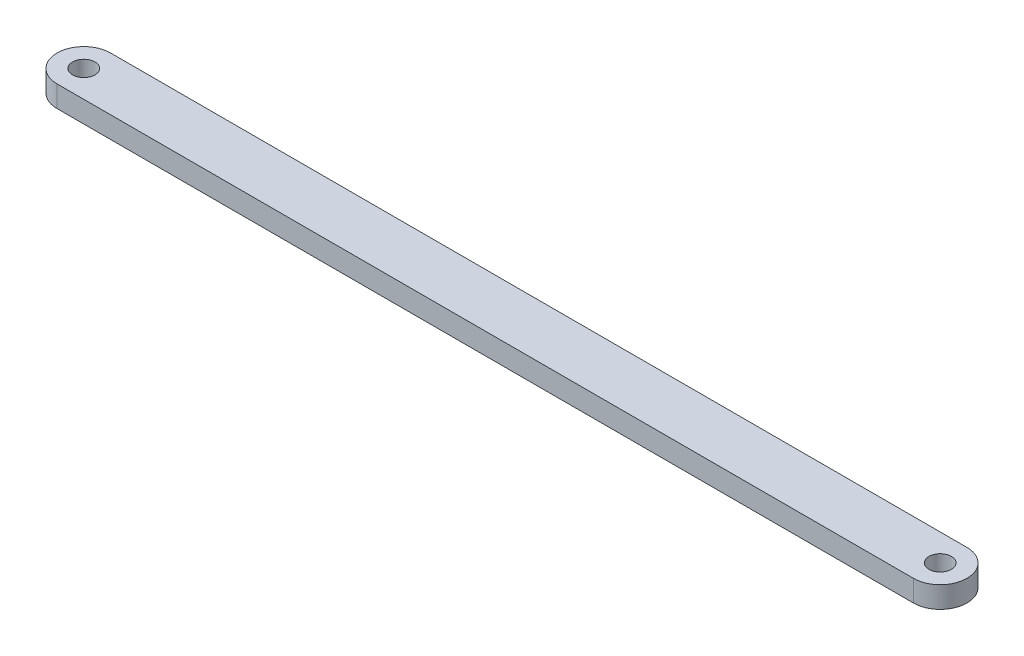
ISO-10303-21;
HEADER;
FILE_DESCRIPTION(('STEP AP214'),'2;1');
FILE_NAME('part.step','',(''),(''),'','','');
FILE_SCHEMA(('AUTOMOTIVE_DESIGN { 1 0 10303 214 1 1 1 1 }'));
ENDSEC;
DATA;
#1=APPLICATION_CONTEXT('core data for automotive mechanical design processes');
#2=APPLICATION_PROTOCOL_DEFINITION('international standard','automotive_design',2000,#1);
#3=PRODUCT_CONTEXT('',#1,'mechanical');
#4=PRODUCT('Part','Part','',(#3));
#5=PRODUCT_RELATED_PRODUCT_CATEGORY('part','',(#4));
#6=PRODUCT_DEFINITION_FORMATION('','',#4);
#7=PRODUCT_DEFINITION_CONTEXT('part definition',#1,'design');
#8=PRODUCT_DEFINITION('design','',#6,#7);
#9=PRODUCT_DEFINITION_SHAPE('','',#8);
#10=(LENGTH_UNIT() NAMED_UNIT(*) SI_UNIT(.MILLI.,.METRE.));
#11=(NAMED_UNIT(*) PLANE_ANGLE_UNIT() SI_UNIT($,.RADIAN.));
#12=(NAMED_UNIT(*) SI_UNIT($,.STERADIAN.) SOLID_ANGLE_UNIT());
#13=UNCERTAINTY_MEASURE_WITH_UNIT(LENGTH_MEASURE(1.E-05),#10,'distance_accuracy_value','');
#14=(GEOMETRIC_REPRESENTATION_CONTEXT(3) GLOBAL_UNCERTAINTY_ASSIGNED_CONTEXT((#13)) GLOBAL_UNIT_ASSIGNED_CONTEXT((#10,
#11,#12)) REPRESENTATION_CONTEXT('',''));
#15=CARTESIAN_POINT('',(0.,0.,0.));
#16=DIRECTION('',(0.,0.,1.));
#17=DIRECTION('',(1.,0.,0.));
#18=AXIS2_PLACEMENT_3D('',#15,#16,#17);
#19=CARTESIAN_POINT('',(0.,2.,0.));
#20=DIRECTION('',(0.,1.,0.));
#21=DIRECTION('',(0.,0.,1.));
#22=AXIS2_PLACEMENT_3D('',#19,#20,#21);
#23=PLANE('',#22);
#24=CARTESIAN_POINT('',(0.,2.,0.));
#25=DIRECTION('',(0.,1.,0.));
#26=DIRECTION('',(0.,0.,1.));
#27=AXIS2_PLACEMENT_3D('',#24,#25,#26);
#28=CIRCLE('',#27,1.05);
#29=CARTESIAN_POINT('',(0.,2.,1.05));
#30=VERTEX_POINT('',#29);
#31=EDGE_CURVE('E103',#30,#30,#28,.T.);
#32=ORIENTED_EDGE('',*,*,#31,.F.);
#33=EDGE_LOOP('',(#32));
#34=FACE_BOUND('',#33,.T.);
#35=CARTESIAN_POINT('',(0.,2.,0.));
#36=DIRECTION('',(0.,1.,0.));
#37=DIRECTION('',(0.,0.,1.));
#38=AXIS2_PLACEMENT_3D('',#35,#36,#37);
#39=CIRCLE('',#38,2.5);
#40=CARTESIAN_POINT('',(0.,2.,-2.5));
#41=VERTEX_POINT('',#40);
#42=CARTESIAN_POINT('',(0.,2.,2.5));
#43=VERTEX_POINT('',#42);
#44=EDGE_CURVE('E88',#41,#43,#39,.T.);
#45=ORIENTED_EDGE('',*,*,#44,.T.);
#46=DIRECTION('',(1.,0.,0.));
#47=VECTOR('',#46,1.);
#48=CARTESIAN_POINT('',(0.,2.,2.5));
#49=LINE('',#48,#47);
#50=CARTESIAN_POINT('',(80.,2.,2.5));
#51=VERTEX_POINT('',#50);
#52=EDGE_CURVE('E83',#43,#51,#49,.T.);
#53=ORIENTED_EDGE('',*,*,#52,.T.);
#54=CARTESIAN_POINT('',(80.,2.,0.));
#55=DIRECTION('',(0.,1.,0.));
#56=DIRECTION('',(0.,0.,1.));
#57=AXIS2_PLACEMENT_3D('',#54,#55,#56);
#58=CIRCLE('',#57,2.5);
#59=CARTESIAN_POINT('',(80.,2.,-2.5));
#60=VERTEX_POINT('',#59);
#61=EDGE_CURVE('E86',#51,#60,#58,.T.);
#62=ORIENTED_EDGE('',*,*,#61,.T.);
#63=DIRECTION('',(-1.,0.,0.));
#64=VECTOR('',#63,1.);
#65=CARTESIAN_POINT('',(0.,2.,-2.5));
#66=LINE('',#65,#64);
#67=EDGE_CURVE('E53',#60,#41,#66,.T.);
#68=ORIENTED_EDGE('',*,*,#67,.T.);
#69=EDGE_LOOP('',(#45,#53,#62,#68));
#70=FACE_BOUND('',#69,.T.);
#71=CARTESIAN_POINT('',(80.,2.,0.));
#72=DIRECTION('',(0.,1.,0.));
#73=DIRECTION('',(0.,0.,1.));
#74=AXIS2_PLACEMENT_3D('',#71,#72,#73);
#75=CIRCLE('',#74,1.04999999999999);
#76=CARTESIAN_POINT('',(80.,2.,1.04999999999999));
#77=VERTEX_POINT('',#76);
#78=EDGE_CURVE('E118',#77,#77,#75,.T.);
#79=ORIENTED_EDGE('',*,*,#78,.F.);
#80=EDGE_LOOP('',(#79));
#81=FACE_BOUND('',#80,.T.);
#82=ADVANCED_FACE('F36',(#34,#70,#81),#23,.T.);
#83=CARTESIAN_POINT('',(0.,0.,0.));
#84=DIRECTION('',(0.,1.,0.));
#85=DIRECTION('',(0.,0.,1.));
#86=AXIS2_PLACEMENT_3D('',#83,#84,#85);
#87=PLANE('',#86);
#88=CARTESIAN_POINT('',(0.,0.,0.));
#89=DIRECTION('',(0.,1.,0.));
#90=DIRECTION('',(0.,0.,1.));
#91=AXIS2_PLACEMENT_3D('',#88,#89,#90);
#92=CIRCLE('',#91,2.5);
#93=CARTESIAN_POINT('',(0.,0.,-2.5));
#94=VERTEX_POINT('',#93);
#95=CARTESIAN_POINT('',(0.,0.,2.5));
#96=VERTEX_POINT('',#95);
#97=EDGE_CURVE('E100',#94,#96,#92,.T.);
#98=ORIENTED_EDGE('',*,*,#97,.F.);
#99=DIRECTION('',(-1.,0.,0.));
#100=VECTOR('',#99,1.);
#101=CARTESIAN_POINT('',(0.,0.,-2.5));
#102=LINE('',#101,#100);
#103=CARTESIAN_POINT('',(80.,0.,-2.5));
#104=VERTEX_POINT('',#103);
#105=EDGE_CURVE('E76',#104,#94,#102,.T.);
#106=ORIENTED_EDGE('',*,*,#105,.F.);
#107=CARTESIAN_POINT('',(80.,0.,0.));
#108=DIRECTION('',(0.,1.,0.));
#109=DIRECTION('',(0.,0.,1.));
#110=AXIS2_PLACEMENT_3D('',#107,#108,#109);
#111=CIRCLE('',#110,2.5);
#112=CARTESIAN_POINT('',(80.,0.,2.5));
#113=VERTEX_POINT('',#112);
#114=EDGE_CURVE('E70',#113,#104,#111,.T.);
#115=ORIENTED_EDGE('',*,*,#114,.F.);
#116=DIRECTION('',(1.,0.,0.));
#117=VECTOR('',#116,1.);
#118=CARTESIAN_POINT('',(0.,0.,2.5));
#119=LINE('',#118,#117);
#120=EDGE_CURVE('E92',#96,#113,#119,.T.);
#121=ORIENTED_EDGE('',*,*,#120,.F.);
#122=EDGE_LOOP('',(#98,#106,#115,#121));
#123=FACE_BOUND('',#122,.T.);
#124=CARTESIAN_POINT('',(0.,0.,0.));
#125=DIRECTION('',(0.,1.,0.));
#126=DIRECTION('',(0.,0.,1.));
#127=AXIS2_PLACEMENT_3D('',#124,#125,#126);
#128=CIRCLE('',#127,1.05);
#129=CARTESIAN_POINT('',(0.,0.,1.05));
#130=VERTEX_POINT('',#129);
#131=EDGE_CURVE('E115',#130,#130,#128,.T.);
#132=ORIENTED_EDGE('',*,*,#131,.T.);
#133=EDGE_LOOP('',(#132));
#134=FACE_BOUND('',#133,.T.);
#135=CARTESIAN_POINT('',(80.,0.,0.));
#136=DIRECTION('',(0.,1.,0.));
#137=DIRECTION('',(0.,0.,1.));
#138=AXIS2_PLACEMENT_3D('',#135,#136,#137);
#139=CIRCLE('',#138,1.04999999999999);
#140=CARTESIAN_POINT('',(80.,0.,1.04999999999999));
#141=VERTEX_POINT('',#140);
#142=EDGE_CURVE('E121',#141,#141,#139,.T.);
#143=ORIENTED_EDGE('',*,*,#142,.T.);
#144=EDGE_LOOP('',(#143));
#145=FACE_BOUND('',#144,.T.);
#146=ADVANCED_FACE('F111',(#123,#134,#145),#87,.F.);
#147=CARTESIAN_POINT('',(0.,2.,0.));
#148=DIRECTION('',(0.,-1.,0.));
#149=DIRECTION('',(0.,0.,-1.));
#150=AXIS2_PLACEMENT_3D('',#147,#148,#149);
#151=CYLINDRICAL_SURFACE('',#150,2.5);
#152=ORIENTED_EDGE('',*,*,#97,.T.);
#153=DIRECTION('',(0.,-1.,0.));
#154=VECTOR('',#153,1.);
#155=CARTESIAN_POINT('',(0.,2.,2.5));
#156=LINE('',#155,#154);
#157=EDGE_CURVE('E11',#43,#96,#156,.T.);
#158=ORIENTED_EDGE('',*,*,#157,.F.);
#159=ORIENTED_EDGE('',*,*,#44,.F.);
#160=DIRECTION('',(0.,-1.,0.));
#161=VECTOR('',#160,1.);
#162=CARTESIAN_POINT('',(0.,2.,-2.5));
#163=LINE('',#162,#161);
#164=EDGE_CURVE('E96',#41,#94,#163,.T.);
#165=ORIENTED_EDGE('',*,*,#164,.T.);
#166=EDGE_LOOP('',(#152,#158,#159,#165));
#167=FACE_BOUND('',#166,.T.);
#168=ADVANCED_FACE('F38',(#167),#151,.T.);
#169=CARTESIAN_POINT('',(0.,2.,2.5));
#170=DIRECTION('',(0.,0.,-1.));
#171=DIRECTION('',(-1.,0.,0.));
#172=AXIS2_PLACEMENT_3D('',#169,#170,#171);
#173=PLANE('',#172);
#174=ORIENTED_EDGE('',*,*,#120,.T.);
#175=DIRECTION('',(0.,-1.,0.));
#176=VECTOR('',#175,1.);
#177=CARTESIAN_POINT('',(80.,2.,2.5));
#178=LINE('',#177,#176);
#179=EDGE_CURVE('E45',#51,#113,#178,.T.);
#180=ORIENTED_EDGE('',*,*,#179,.F.);
#181=ORIENTED_EDGE('',*,*,#52,.F.);
#182=ORIENTED_EDGE('',*,*,#157,.T.);
#183=EDGE_LOOP('',(#174,#180,#181,#182));
#184=FACE_BOUND('',#183,.T.);
#185=ADVANCED_FACE('F91',(#184),#173,.F.);
#186=CARTESIAN_POINT('',(80.,2.,0.));
#187=DIRECTION('',(0.,-1.,0.));
#188=DIRECTION('',(0.,0.,-1.));
#189=AXIS2_PLACEMENT_3D('',#186,#187,#188);
#190=CYLINDRICAL_SURFACE('',#189,2.5);
#191=ORIENTED_EDGE('',*,*,#114,.T.);
#192=DIRECTION('',(0.,-1.,0.));
#193=VECTOR('',#192,1.);
#194=CARTESIAN_POINT('',(80.,2.,-2.5));
#195=LINE('',#194,#193);
#196=EDGE_CURVE('E93',#60,#104,#195,.T.);
#197=ORIENTED_EDGE('',*,*,#196,.F.);
#198=ORIENTED_EDGE('',*,*,#61,.F.);
#199=ORIENTED_EDGE('',*,*,#179,.T.);
#200=EDGE_LOOP('',(#191,#197,#198,#199));
#201=FACE_BOUND('',#200,.T.);
#202=ADVANCED_FACE('F94',(#201),#190,.T.);
#203=CARTESIAN_POINT('',(0.,2.,-2.5));
#204=DIRECTION('',(0.,0.,1.));
#205=DIRECTION('',(1.,0.,0.));
#206=AXIS2_PLACEMENT_3D('',#203,#204,#205);
#207=PLANE('',#206);
#208=ORIENTED_EDGE('',*,*,#105,.T.);
#209=ORIENTED_EDGE('',*,*,#164,.F.);
#210=ORIENTED_EDGE('',*,*,#67,.F.);
#211=ORIENTED_EDGE('',*,*,#196,.T.);
#212=EDGE_LOOP('',(#208,#209,#210,#211));
#213=FACE_BOUND('',#212,.T.);
#214=ADVANCED_FACE('F108',(#213),#207,.F.);
#215=CARTESIAN_POINT('',(0.,2.,0.));
#216=DIRECTION('',(0.,-1.,0.));
#217=DIRECTION('',(0.,0.,-1.));
#218=AXIS2_PLACEMENT_3D('',#215,#216,#217);
#219=CYLINDRICAL_SURFACE('',#218,1.05);
#220=ORIENTED_EDGE('',*,*,#31,.T.);
#221=EDGE_LOOP('',(#220));
#222=FACE_BOUND('',#221,.T.);
#223=ORIENTED_EDGE('',*,*,#131,.F.);
#224=EDGE_LOOP('',(#223));
#225=FACE_BOUND('',#224,.T.);
#226=ADVANCED_FACE('F138',(#222,#225),#219,.F.);
#227=CARTESIAN_POINT('',(80.,2.,0.));
#228=DIRECTION('',(0.,-1.,0.));
#229=DIRECTION('',(0.,0.,-1.));
#230=AXIS2_PLACEMENT_3D('',#227,#228,#229);
#231=CYLINDRICAL_SURFACE('',#230,1.04999999999999);
#232=ORIENTED_EDGE('',*,*,#78,.T.);
#233=EDGE_LOOP('',(#232));
#234=FACE_BOUND('',#233,.T.);
#235=ORIENTED_EDGE('',*,*,#142,.F.);
#236=EDGE_LOOP('',(#235));
#237=FACE_BOUND('',#236,.T.);
#238=ADVANCED_FACE('F127',(#234,#237),#231,.F.);
#239=CLOSED_SHELL('',(#82,#146,#168,#185,#202,#214,#226,#238));
#240=MANIFOLD_SOLID_BREP('B2',#239);
#241=ADVANCED_BREP_SHAPE_REPRESENTATION('',(#18,#240),#14);
#242=SHAPE_DEFINITION_REPRESENTATION(#9,#241);
ENDSEC;
END-ISO-10303-21;
